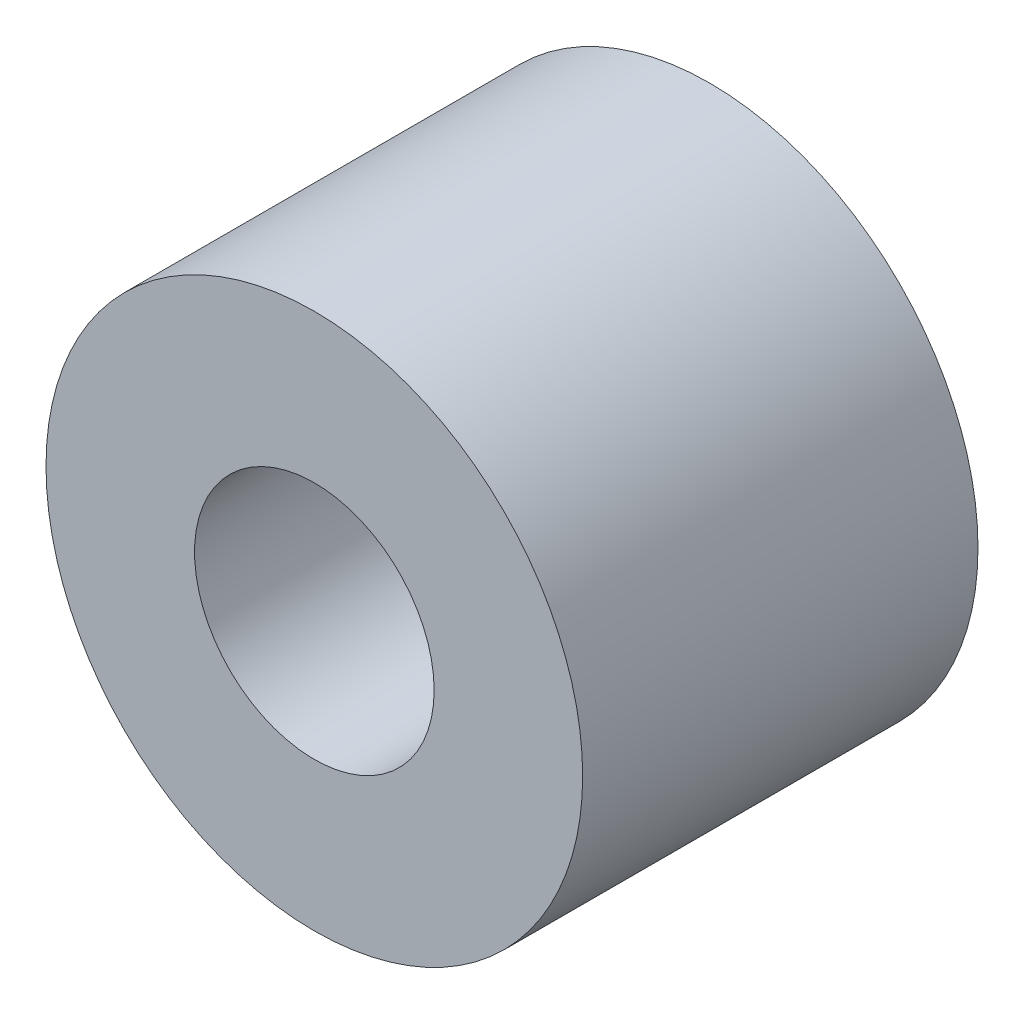
ISO-10303-21;
HEADER;
FILE_DESCRIPTION(('STEP AP214'),'2;1');
FILE_NAME('part.step','',(''),(''),'','','');
FILE_SCHEMA(('AUTOMOTIVE_DESIGN { 1 0 10303 214 1 1 1 1 }'));
ENDSEC;
DATA;
#1=APPLICATION_CONTEXT('core data for automotive mechanical design processes');
#2=APPLICATION_PROTOCOL_DEFINITION('international standard','automotive_design',2000,#1);
#3=PRODUCT_CONTEXT('',#1,'mechanical');
#4=PRODUCT('Part','Part','',(#3));
#5=PRODUCT_RELATED_PRODUCT_CATEGORY('part','',(#4));
#6=PRODUCT_DEFINITION_FORMATION('','',#4);
#7=PRODUCT_DEFINITION_CONTEXT('part definition',#1,'design');
#8=PRODUCT_DEFINITION('design','',#6,#7);
#9=PRODUCT_DEFINITION_SHAPE('','',#8);
#10=(LENGTH_UNIT() NAMED_UNIT(*) SI_UNIT(.MILLI.,.METRE.));
#11=(NAMED_UNIT(*) PLANE_ANGLE_UNIT() SI_UNIT($,.RADIAN.));
#12=(NAMED_UNIT(*) SI_UNIT($,.STERADIAN.) SOLID_ANGLE_UNIT());
#13=UNCERTAINTY_MEASURE_WITH_UNIT(LENGTH_MEASURE(1.E-05),#10,'distance_accuracy_value','');
#14=(GEOMETRIC_REPRESENTATION_CONTEXT(3) GLOBAL_UNCERTAINTY_ASSIGNED_CONTEXT((#13)) GLOBAL_UNIT_ASSIGNED_CONTEXT((#10,
#11,#12)) REPRESENTATION_CONTEXT('',''));
#15=CARTESIAN_POINT('',(0.,0.,0.));
#16=DIRECTION('',(0.,0.,1.));
#17=DIRECTION('',(1.,0.,0.));
#18=AXIS2_PLACEMENT_3D('',#15,#16,#17);
#19=CARTESIAN_POINT('',(0.,0.,20.955));
#20=DIRECTION('',(0.,0.,1.));
#21=DIRECTION('',(1.,0.,0.));
#22=AXIS2_PLACEMENT_3D('',#19,#20,#21);
#23=PLANE('',#22);
#24=CARTESIAN_POINT('',(0.,0.,20.955));
#25=DIRECTION('',(0.,0.,1.));
#26=DIRECTION('',(1.,0.,0.));
#27=AXIS2_PLACEMENT_3D('',#24,#25,#26);
#28=CIRCLE('',#27,14.224);
#29=CARTESIAN_POINT('',(14.224,0.,20.955));
#30=VERTEX_POINT('',#29);
#31=EDGE_CURVE('E10',#30,#30,#28,.T.);
#32=ORIENTED_EDGE('',*,*,#31,.T.);
#33=EDGE_LOOP('',(#32));
#34=FACE_BOUND('',#33,.T.);
#35=CARTESIAN_POINT('',(0.,0.,20.955));
#36=DIRECTION('',(0.,0.,1.));
#37=DIRECTION('',(1.,0.,0.));
#38=AXIS2_PLACEMENT_3D('',#35,#36,#37);
#39=CIRCLE('',#38,6.35);
#40=CARTESIAN_POINT('',(6.35,0.,20.955));
#41=VERTEX_POINT('',#40);
#42=EDGE_CURVE('E50',#41,#41,#39,.T.);
#43=ORIENTED_EDGE('',*,*,#42,.F.);
#44=EDGE_LOOP('',(#43));
#45=FACE_BOUND('',#44,.T.);
#46=ADVANCED_FACE('F37',(#34,#45),#23,.T.);
#47=CARTESIAN_POINT('',(0.,0.,0.));
#48=DIRECTION('',(0.,0.,1.));
#49=DIRECTION('',(1.,0.,0.));
#50=AXIS2_PLACEMENT_3D('',#47,#48,#49);
#51=PLANE('',#50);
#52=CARTESIAN_POINT('',(0.,0.,0.));
#53=DIRECTION('',(0.,0.,1.));
#54=DIRECTION('',(1.,0.,0.));
#55=AXIS2_PLACEMENT_3D('',#52,#53,#54);
#56=CIRCLE('',#55,14.224);
#57=CARTESIAN_POINT('',(14.224,0.,0.));
#58=VERTEX_POINT('',#57);
#59=EDGE_CURVE('E41',#58,#58,#56,.T.);
#60=ORIENTED_EDGE('',*,*,#59,.F.);
#61=EDGE_LOOP('',(#60));
#62=FACE_BOUND('',#61,.T.);
#63=CARTESIAN_POINT('',(0.,0.,0.));
#64=DIRECTION('',(0.,0.,1.));
#65=DIRECTION('',(1.,0.,0.));
#66=AXIS2_PLACEMENT_3D('',#63,#64,#65);
#67=CIRCLE('',#66,6.35);
#68=CARTESIAN_POINT('',(6.35,0.,0.));
#69=VERTEX_POINT('',#68);
#70=EDGE_CURVE('E52',#69,#69,#67,.T.);
#71=ORIENTED_EDGE('',*,*,#70,.T.);
#72=EDGE_LOOP('',(#71));
#73=FACE_BOUND('',#72,.T.);
#74=ADVANCED_FACE('F64',(#62,#73),#51,.F.);
#75=CARTESIAN_POINT('',(0.,0.,20.955));
#76=DIRECTION('',(0.,0.,-1.));
#77=DIRECTION('',(-1.,0.,0.));
#78=AXIS2_PLACEMENT_3D('',#75,#76,#77);
#79=CYLINDRICAL_SURFACE('',#78,14.224);
#80=ORIENTED_EDGE('',*,*,#31,.F.);
#81=EDGE_LOOP('',(#80));
#82=FACE_BOUND('',#81,.T.);
#83=ORIENTED_EDGE('',*,*,#59,.T.);
#84=EDGE_LOOP('',(#83));
#85=FACE_BOUND('',#84,.T.);
#86=ADVANCED_FACE('F39',(#82,#85),#79,.T.);
#87=CARTESIAN_POINT('',(0.,0.,20.955));
#88=DIRECTION('',(0.,0.,-1.));
#89=DIRECTION('',(-1.,0.,0.));
#90=AXIS2_PLACEMENT_3D('',#87,#88,#89);
#91=CYLINDRICAL_SURFACE('',#90,6.35);
#92=ORIENTED_EDGE('',*,*,#42,.T.);
#93=EDGE_LOOP('',(#92));
#94=FACE_BOUND('',#93,.T.);
#95=ORIENTED_EDGE('',*,*,#70,.F.);
#96=EDGE_LOOP('',(#95));
#97=FACE_BOUND('',#96,.T.);
#98=ADVANCED_FACE('F60',(#94,#97),#91,.F.);
#99=CLOSED_SHELL('',(#46,#74,#86,#98));
#100=MANIFOLD_SOLID_BREP('B2',#99);
#101=ADVANCED_BREP_SHAPE_REPRESENTATION('',(#18,#100),#14);
#102=SHAPE_DEFINITION_REPRESENTATION(#9,#101);
ENDSEC;
END-ISO-10303-21;
